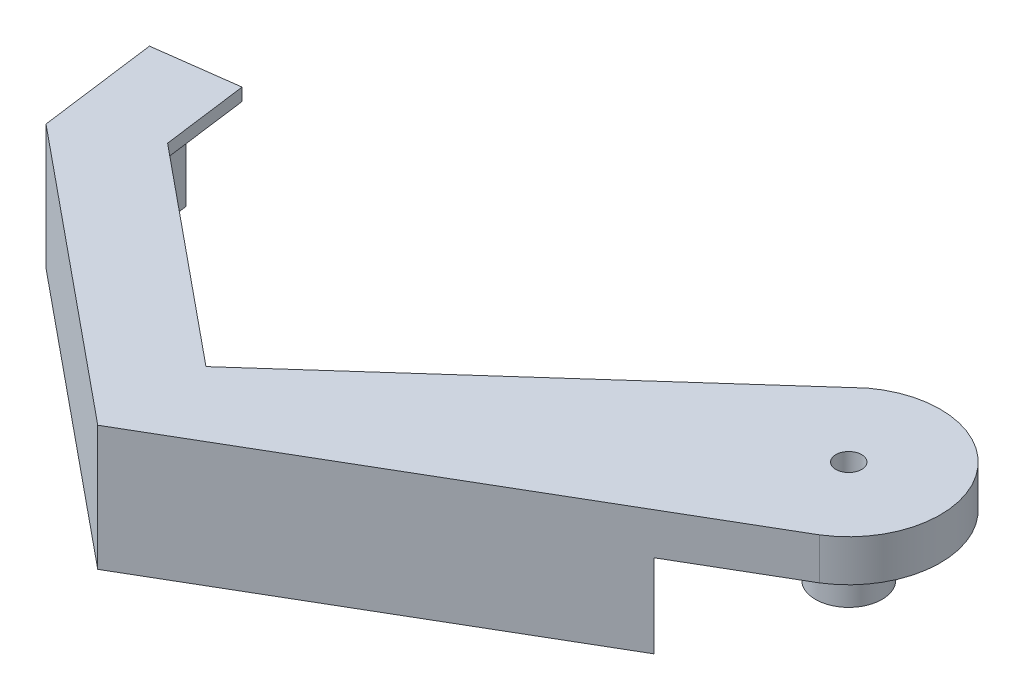
ISO-10303-21;
HEADER;
FILE_DESCRIPTION(('STEP AP214'),'2;1');
FILE_NAME('part.step','',(''),(''),'','','');
FILE_SCHEMA(('AUTOMOTIVE_DESIGN { 1 0 10303 214 1 1 1 1 }'));
ENDSEC;
DATA;
#1=APPLICATION_CONTEXT('core data for automotive mechanical design processes');
#2=APPLICATION_PROTOCOL_DEFINITION('international standard','automotive_design',2000,#1);
#3=PRODUCT_CONTEXT('',#1,'mechanical');
#4=PRODUCT('Part','Part','',(#3));
#5=PRODUCT_RELATED_PRODUCT_CATEGORY('part','',(#4));
#6=PRODUCT_DEFINITION_FORMATION('','',#4);
#7=PRODUCT_DEFINITION_CONTEXT('part definition',#1,'design');
#8=PRODUCT_DEFINITION('design','',#6,#7);
#9=PRODUCT_DEFINITION_SHAPE('','',#8);
#10=(LENGTH_UNIT() NAMED_UNIT(*) SI_UNIT(.MILLI.,.METRE.));
#11=(NAMED_UNIT(*) PLANE_ANGLE_UNIT() SI_UNIT($,.RADIAN.));
#12=(NAMED_UNIT(*) SI_UNIT($,.STERADIAN.) SOLID_ANGLE_UNIT());
#13=UNCERTAINTY_MEASURE_WITH_UNIT(LENGTH_MEASURE(1.E-05),#10,'distance_accuracy_value','');
#14=(GEOMETRIC_REPRESENTATION_CONTEXT(3) GLOBAL_UNCERTAINTY_ASSIGNED_CONTEXT((#13)) GLOBAL_UNIT_ASSIGNED_CONTEXT((#10,
#11,#12)) REPRESENTATION_CONTEXT('',''));
#15=CARTESIAN_POINT('',(0.,0.,0.));
#16=DIRECTION('',(0.,0.,1.));
#17=DIRECTION('',(1.,0.,0.));
#18=AXIS2_PLACEMENT_3D('',#15,#16,#17);
#19=CARTESIAN_POINT('',(0.,3.70000000000001,0.));
#20=DIRECTION('',(0.,-1.,0.));
#21=DIRECTION('',(0.,0.,-1.));
#22=AXIS2_PLACEMENT_3D('',#19,#20,#21);
#23=CYLINDRICAL_SURFACE('',#22,1.55);
#24=CARTESIAN_POINT('',(0.,3.,0.));
#25=DIRECTION('',(0.,1.,0.));
#26=DIRECTION('',(0.,0.,1.));
#27=AXIS2_PLACEMENT_3D('',#24,#25,#26);
#28=CIRCLE('',#27,1.55);
#29=CARTESIAN_POINT('',(0.,3.,1.55));
#30=VERTEX_POINT('',#29);
#31=EDGE_CURVE('E374',#30,#30,#28,.T.);
#32=ORIENTED_EDGE('',*,*,#31,.T.);
#33=EDGE_LOOP('',(#32));
#34=FACE_BOUND('',#33,.T.);
#35=CARTESIAN_POINT('',(0.,-2.8,0.));
#36=DIRECTION('',(0.,-1.,0.));
#37=DIRECTION('',(0.,0.,-1.));
#38=AXIS2_PLACEMENT_3D('',#35,#36,#37);
#39=CIRCLE('',#38,1.55);
#40=CARTESIAN_POINT('',(0.,-2.8,-1.55));
#41=VERTEX_POINT('',#40);
#42=EDGE_CURVE('E42',#41,#41,#39,.F.);
#43=ORIENTED_EDGE('',*,*,#42,.F.);
#44=EDGE_LOOP('',(#43));
#45=FACE_BOUND('',#44,.T.);
#46=ADVANCED_FACE('F38',(#34,#45),#23,.F.);
#47=CARTESIAN_POINT('',(-48.9483075080207,-2.,41.2817048164153));
#48=DIRECTION('',(-0.50386727867447,0.,-0.863781086549818));
#49=DIRECTION('',(-0.863781086549818,0.,0.50386727867447));
#50=AXIS2_PLACEMENT_3D('',#47,#48,#49);
#51=PLANE('',#50);
#52=DIRECTION('',(0.,1.,0.));
#53=VECTOR('',#52,1.);
#54=CARTESIAN_POINT('',(5.82912243152657,-2.,9.32852248098656));
#55=LINE('',#54,#53);
#56=CARTESIAN_POINT('',(5.82912243152657,-2.,9.32852248098656));
#57=VERTEX_POINT('',#56);
#58=CARTESIAN_POINT('',(5.82912243152657,3.,9.32852248098656));
#59=VERTEX_POINT('',#58);
#60=EDGE_CURVE('E48',#57,#59,#55,.T.);
#61=ORIENTED_EDGE('',*,*,#60,.T.);
#62=DIRECTION('',(-0.863781086549818,0.,0.50386727867447));
#63=VECTOR('',#62,1.);
#64=CARTESIAN_POINT('',(-48.9483075080207,3.,41.2817048164153));
#65=LINE('',#64,#63);
#66=CARTESIAN_POINT('',(-48.9483075080207,3.,41.2817048164153));
#67=VERTEX_POINT('',#66);
#68=EDGE_CURVE('E57',#59,#67,#65,.T.);
#69=ORIENTED_EDGE('',*,*,#68,.T.);
#70=DIRECTION('',(0.,1.,0.));
#71=VECTOR('',#70,1.);
#72=CARTESIAN_POINT('',(-48.9483075080207,-2.,41.2817048164153));
#73=LINE('',#72,#71);
#74=CARTESIAN_POINT('',(-48.9483075080207,-12.,41.2817048164153));
#75=VERTEX_POINT('',#74);
#76=EDGE_CURVE('E248',#75,#67,#73,.T.);
#77=ORIENTED_EDGE('',*,*,#76,.F.);
#78=DIRECTION('',(-0.863781086549818,0.,0.50386727867447));
#79=VECTOR('',#78,1.);
#80=CARTESIAN_POINT('',(-6.7200200176751,-12.,16.6487826186955));
#81=LINE('',#80,#79);
#82=CARTESIAN_POINT('',(-6.7200200176751,-12.,16.6487826186955));
#83=VERTEX_POINT('',#82);
#84=EDGE_CURVE('E185',#83,#75,#81,.T.);
#85=ORIENTED_EDGE('',*,*,#84,.F.);
#86=DIRECTION('',(0.,1.,0.));
#87=VECTOR('',#86,1.);
#88=CARTESIAN_POINT('',(-6.7200200176751,-12.,16.6487826186955));
#89=LINE('',#88,#87);
#90=CARTESIAN_POINT('',(-6.72002001767509,-2.,16.6487826186955));
#91=VERTEX_POINT('',#90);
#92=EDGE_CURVE('E273',#83,#91,#89,.T.);
#93=ORIENTED_EDGE('',*,*,#92,.T.);
#94=DIRECTION('',(-0.863781086549818,0.,0.50386727867447));
#95=VECTOR('',#94,1.);
#96=CARTESIAN_POINT('',(-48.9483075080207,-2.,41.2817048164153));
#97=LINE('',#96,#95);
#98=EDGE_CURVE('E242',#57,#91,#97,.T.);
#99=ORIENTED_EDGE('',*,*,#98,.F.);
#100=EDGE_LOOP('',(#61,#69,#77,#85,#93,#99));
#101=FACE_BOUND('',#100,.T.);
#102=ADVANCED_FACE('F319',(#101),#51,.F.);
#103=CARTESIAN_POINT('',(0.,-2.,0.));
#104=DIRECTION('',(0.,1.,0.));
#105=DIRECTION('',(0.,0.,1.));
#106=AXIS2_PLACEMENT_3D('',#103,#104,#105);
#107=PLANE('',#106);
#108=CARTESIAN_POINT('',(-2.27609272575313E-12,-2.,-4.13835632429027E-11));
#109=DIRECTION('',(0.,1.,0.));
#110=DIRECTION('',(0.,0.,1.));
#111=AXIS2_PLACEMENT_3D('',#108,#109,#110);
#112=CIRCLE('',#111,6.3);
#113=CARTESIAN_POINT('',(-2.27609272575313E-12,-2.,6.29999999995862));
#114=VERTEX_POINT('',#113);
#115=EDGE_CURVE('E243',#114,#114,#112,.F.);
#116=ORIENTED_EDGE('',*,*,#115,.F.);
#117=EDGE_LOOP('',(#116));
#118=FACE_BOUND('',#117,.T.);
#119=CARTESIAN_POINT('',(0.,-2.,0.));
#120=DIRECTION('',(0.,-1.,0.));
#121=DIRECTION('',(0.,0.,1.));
#122=AXIS2_PLACEMENT_3D('',#119,#120,#121);
#123=CIRCLE('',#122,10.9999999999999);
#124=CARTESIAN_POINT('',(-6.54255549837644,-2.,-8.84279184141876));
#125=VERTEX_POINT('',#124);
#126=EDGE_CURVE('E262',#125,#57,#123,.T.);
#127=ORIENTED_EDGE('',*,*,#126,.T.);
#128=ORIENTED_EDGE('',*,*,#98,.T.);
#129=CARTESIAN_POINT('',(0.,-2.,0.));
#130=DIRECTION('',(0.,1.,0.));
#131=DIRECTION('',(0.,0.,-1.));
#132=AXIS2_PLACEMENT_3D('',#129,#130,#131);
#133=CIRCLE('',#132,17.9538472679961);
#134=CARTESIAN_POINT('',(-12.8140115491981,-2.,12.5754419301887));
#135=VERTEX_POINT('',#134);
#136=EDGE_CURVE('E196',#135,#91,#133,.T.);
#137=ORIENTED_EDGE('',*,*,#136,.F.);
#138=CARTESIAN_POINT('',(0.,-2.,0.));
#139=DIRECTION('',(0.,1.,0.));
#140=DIRECTION('',(0.,0.,-1.));
#141=AXIS2_PLACEMENT_3D('',#138,#139,#140);
#142=CIRCLE('',#141,17.9538472679961);
#143=CARTESIAN_POINT('',(-17.9060104259916,-2.,1.30974132820591));
#144=VERTEX_POINT('',#143);
#145=EDGE_CURVE('E204',#144,#135,#142,.T.);
#146=ORIENTED_EDGE('',*,*,#145,.F.);
#147=DIRECTION('',(0.745722729369561,0.,-0.666256415279893));
#148=VECTOR('',#147,1.);
#149=CARTESIAN_POINT('',(-6.54255549837644,-2.,-8.84279184141876));
#150=LINE('',#149,#148);
#151=EDGE_CURVE('E277',#144,#125,#150,.T.);
#152=ORIENTED_EDGE('',*,*,#151,.T.);
#153=EDGE_LOOP('',(#127,#128,#137,#146,#152));
#154=FACE_BOUND('',#153,.T.);
#155=ADVANCED_FACE('F399',(#118,#154),#107,.F.);
#156=CARTESIAN_POINT('',(0.,3.,0.));
#157=DIRECTION('',(0.,1.,0.));
#158=DIRECTION('',(0.,0.,1.));
#159=AXIS2_PLACEMENT_3D('',#156,#157,#158);
#160=PLANE('',#159);
#161=ORIENTED_EDGE('',*,*,#31,.F.);
#162=EDGE_LOOP('',(#161));
#163=FACE_BOUND('',#162,.T.);
#164=ORIENTED_EDGE('',*,*,#68,.F.);
#165=CARTESIAN_POINT('',(0.,3.,0.));
#166=DIRECTION('',(0.,-1.,0.));
#167=DIRECTION('',(0.,0.,1.));
#168=AXIS2_PLACEMENT_3D('',#165,#166,#167);
#169=CIRCLE('',#168,10.9999999999999);
#170=CARTESIAN_POINT('',(-6.54255549837644,3.,-8.84279184141876));
#171=VERTEX_POINT('',#170);
#172=EDGE_CURVE('E258',#171,#59,#169,.T.);
#173=ORIENTED_EDGE('',*,*,#172,.F.);
#174=DIRECTION('',(0.745722729369561,0.,-0.666256415279893));
#175=VECTOR('',#174,1.);
#176=CARTESIAN_POINT('',(-6.54255549837644,3.,-8.84279184141876));
#177=LINE('',#176,#175);
#178=CARTESIAN_POINT('',(-48.5446549407446,3.,28.6834456012294));
#179=VERTEX_POINT('',#178);
#180=EDGE_CURVE('E202',#179,#171,#177,.T.);
#181=ORIENTED_EDGE('',*,*,#180,.F.);
#182=DIRECTION('',(0.77345150978173,0.,0.633855474076199));
#183=VECTOR('',#182,1.);
#184=CARTESIAN_POINT('',(-74.0969141553462,3.,7.74297399653901));
#185=LINE('',#184,#183);
#186=CARTESIAN_POINT('',(-74.0969141553462,3.,7.74297399653901));
#187=VERTEX_POINT('',#186);
#188=EDGE_CURVE('E255',#187,#179,#185,.T.);
#189=ORIENTED_EDGE('',*,*,#188,.F.);
#190=DIRECTION('',(0.130896701268676,0.,0.991396012498022));
#191=VECTOR('',#190,1.);
#192=CARTESIAN_POINT('',(-75.4582398485404,3.,-2.56754453344042));
#193=LINE('',#192,#191);
#194=CARTESIAN_POINT('',(-75.4582398485404,3.,-2.56754453344042));
#195=VERTEX_POINT('',#194);
#196=EDGE_CURVE('E252',#195,#187,#193,.T.);
#197=ORIENTED_EDGE('',*,*,#196,.F.);
#198=DIRECTION('',(0.991396012498023,0.,-0.130896701268675));
#199=VECTOR('',#198,1.);
#200=CARTESIAN_POINT('',(-75.4582398485404,3.,-2.56754453344042));
#201=LINE('',#200,#199);
#202=CARTESIAN_POINT('',(-85.2869003845102,3.,-1.26983985657133));
#203=VERTEX_POINT('',#202);
#204=EDGE_CURVE('E247',#203,#195,#201,.T.);
#205=ORIENTED_EDGE('',*,*,#204,.F.);
#206=DIRECTION('',(-0.130896701268675,0.,-0.991396012498023));
#207=VECTOR('',#206,1.);
#208=CARTESIAN_POINT('',(-85.2869003845102,3.,-1.26983985657133));
#209=LINE('',#208,#207);
#210=CARTESIAN_POINT('',(-83.396048293419,3.,13.0512484914357));
#211=VERTEX_POINT('',#210);
#212=EDGE_CURVE('E179',#211,#203,#209,.T.);
#213=ORIENTED_EDGE('',*,*,#212,.F.);
#214=DIRECTION('',(-0.77345150978173,0.,-0.633855474076199));
#215=VECTOR('',#214,1.);
#216=CARTESIAN_POINT('',(-48.9483075080207,3.,41.2817048164153));
#217=LINE('',#216,#215);
#218=EDGE_CURVE('E174',#67,#211,#217,.T.);
#219=ORIENTED_EDGE('',*,*,#218,.F.);
#220=EDGE_LOOP('',(#164,#173,#181,#189,#197,#205,#213,#219));
#221=FACE_BOUND('',#220,.T.);
#222=ADVANCED_FACE('F320',(#163,#221),#160,.T.);
#223=CARTESIAN_POINT('',(0.,-2.,0.));
#224=DIRECTION('',(0.,1.,0.));
#225=DIRECTION('',(0.,0.,1.));
#226=AXIS2_PLACEMENT_3D('',#223,#224,#225);
#227=CYLINDRICAL_SURFACE('',#226,10.9999999999999);
#228=ORIENTED_EDGE('',*,*,#60,.F.);
#229=ORIENTED_EDGE('',*,*,#126,.F.);
#230=DIRECTION('',(0.,1.,0.));
#231=VECTOR('',#230,1.);
#232=CARTESIAN_POINT('',(-6.54255549837644,-2.,-8.84279184141876));
#233=LINE('',#232,#231);
#234=EDGE_CURVE('E259',#125,#171,#233,.T.);
#235=ORIENTED_EDGE('',*,*,#234,.T.);
#236=ORIENTED_EDGE('',*,*,#172,.T.);
#237=EDGE_LOOP('',(#228,#229,#235,#236));
#238=FACE_BOUND('',#237,.T.);
#239=ADVANCED_FACE('F408',(#238),#227,.T.);
#240=CARTESIAN_POINT('',(-6.54255549837644,-2.,-8.84279184141876));
#241=DIRECTION('',(0.666256415279893,0.,0.745722729369561));
#242=DIRECTION('',(0.745722729369561,0.,-0.666256415279893));
#243=AXIS2_PLACEMENT_3D('',#240,#241,#242);
#244=PLANE('',#243);
#245=DIRECTION('',(0.,-1.,0.));
#246=VECTOR('',#245,1.);
#247=CARTESIAN_POINT('',(-17.9060104259916,0.5,1.30974132820591));
#248=LINE('',#247,#246);
#249=CARTESIAN_POINT('',(-17.9060104259916,-1.98996327137203,1.30974132820591));
#250=VERTEX_POINT('',#249);
#251=EDGE_CURVE('E127',#250,#144,#248,.T.);
#252=ORIENTED_EDGE('',*,*,#251,.F.);
#253=CARTESIAN_POINT('',(-20.5527162274617,1.67779084483573,3.67440670601832));
#254=CARTESIAN_POINT('',(-20.563587183136,1.62344224762437,3.68411922204195));
#255=CARTESIAN_POINT('',(-20.5731463744474,1.56863301235754,3.69265975900737));
#256=CARTESIAN_POINT('',(-20.5895865959824,1.45830482470025,3.70734806423791));
#257=CARTESIAN_POINT('',(-20.5964679798515,1.40278596702725,3.71349614846308));
#258=CARTESIAN_POINT('',(-20.6130185994757,1.23544723681756,3.72828308745151));
#259=CARTESIAN_POINT('',(-20.6185917019359,1.12285818215963,3.73326230441896));
#260=CARTESIAN_POINT('',(-20.6185986978099,0.86045280736267,3.73326855479294));
#261=CARTESIAN_POINT('',(-20.608750085026,0.710611577728313,3.72446943792223));
#262=CARTESIAN_POINT('',(-20.5698398893561,0.415509893643703,3.68970562227886));
#263=CARTESIAN_POINT('',(-20.5407735503216,0.270250582487615,3.66373667418637));
#264=CARTESIAN_POINT('',(-20.4649802903073,-0.0112133567973825,3.5960201574024));
#265=CARTESIAN_POINT('',(-20.4183033047027,-0.147442318405545,3.55431720283206));
#266=CARTESIAN_POINT('',(-20.3093428780715,-0.408133035892731,3.45696790610881));
#267=CARTESIAN_POINT('',(-20.2470546258765,-0.532591147848141,3.40131726547916));
#268=CARTESIAN_POINT('',(-20.1058500330872,-0.77329544276604,3.27515983174716));
#269=CARTESIAN_POINT('',(-20.0262641947568,-0.888832085155726,3.20405488447291));
#270=CARTESIAN_POINT('',(-19.8553415817637,-1.10294506957164,3.05134626645969));
#271=CARTESIAN_POINT('',(-19.7640015362972,-1.20151667288022,2.9697396734631));
#272=CARTESIAN_POINT('',(-19.5589963347251,-1.39336599562526,2.78658040349064));
#273=CARTESIAN_POINT('',(-19.4439879584825,-1.48405702357262,2.68382764369834));
#274=CARTESIAN_POINT('',(-19.2055454545972,-1.64257745618892,2.47079424451082));
#275=CARTESIAN_POINT('',(-19.0821061227836,-1.71039258407108,2.36050895551585));
#276=CARTESIAN_POINT('',(-18.8080587866526,-1.83337884726971,2.11566487527442));
#277=CARTESIAN_POINT('',(-18.6564163300103,-1.88440035354444,1.98018186585596));
#278=CARTESIAN_POINT('',(-18.3493175408582,-1.95714971889493,1.70580838850432));
#279=CARTESIAN_POINT('',(-18.1938594504494,-1.9788638076752,1.56691634999878));
#280=CARTESIAN_POINT('',(-17.8549016867533,-1.99583714388621,1.26407888014942));
#281=CARTESIAN_POINT('',(-17.6712543665228,-1.98580344582471,1.10000153553639));
#282=CARTESIAN_POINT('',(-17.3068546051834,-1.92932828543307,0.774433238960395));
#283=CARTESIAN_POINT('',(-17.1261063292344,-1.88283852481262,0.612946008306221));
#284=CARTESIAN_POINT('',(-16.849461536696,-1.78285934477431,0.365781263926819));
#285=CARTESIAN_POINT('',(-16.7510730733484,-1.74135303227732,0.277877352307758));
#286=CARTESIAN_POINT('',(-16.5572150233803,-1.64731662594789,0.10467736207267));
#287=CARTESIAN_POINT('',(-16.4617461556412,-1.59478384175087,0.0193819257320101));
#288=CARTESIAN_POINT('',(-16.2746973240672,-1.47874286026964,-0.147734455596674));
#289=CARTESIAN_POINT('',(-16.1831135427376,-1.41524576303724,-0.229558811276384));
#290=CARTESIAN_POINT('',(-16.0047844094393,-1.27714027077309,-0.388884689933398));
#291=CARTESIAN_POINT('',(-15.9180365162036,-1.202537788755,-0.466388483373024));
#292=CARTESIAN_POINT('',(-15.7253123786166,-1.01774172810449,-0.638575394123656));
#293=CARTESIAN_POINT('',(-15.621408642715,-0.903594513808976,-0.731406855321662));
#294=CARTESIAN_POINT('',(-15.4276741531794,-0.655510736765156,-0.904496452071928));
#295=CARTESIAN_POINT('',(-15.3378225855433,-0.52160402463079,-0.984773183627494));
#296=CARTESIAN_POINT('',(-15.1960436260843,-0.267340299498781,-1.11144377789935));
#297=CARTESIAN_POINT('',(-15.140148822152,-0.150978348162458,-1.16138227411788));
#298=CARTESIAN_POINT('',(-15.043163232921,0.0922365525724665,-1.24803280583697));
#299=CARTESIAN_POINT('',(-15.0020284969819,0.219056949517931,-1.28478410847389));
#300=CARTESIAN_POINT('',(-14.9568706528579,0.40274325515857,-1.3251298055579));
#301=CARTESIAN_POINT('',(-14.9453195774546,0.456398008308661,-1.33544996583695));
#302=CARTESIAN_POINT('',(-14.9253472673011,0.564748512141565,-1.35329397037602));
#303=CARTESIAN_POINT('',(-14.9169253046656,0.619444017611745,-1.36081846495577));
#304=CARTESIAN_POINT('',(-14.9033234420317,0.729942393887272,-1.37297087480282));
#305=CARTESIAN_POINT('',(-14.8981662349829,0.785750293214965,-1.37757851534522));
#306=CARTESIAN_POINT('',(-14.8912680731225,0.897781570627464,-1.3837415896517));
#307=CARTESIAN_POINT('',(-14.8895294440171,0.954005205459027,-1.38529494554343));
#308=CARTESIAN_POINT('',(-14.8895447958906,1.01023672862796,-1.38528122960879));
#309=B_SPLINE_CURVE_WITH_KNOTS('',3,(#253,#254,#255,#256,#257,#258,#259,#260,#261,#262,#263,
#264,#265,#266,#267,#268,#269,#270,#271,#272,#273,#274,#275,#276,#277,#278,#279,#280,#281,#282,
#283,#284,#285,#286,#287,#288,#289,#290,#291,#292,#293,#294,#295,#296,#297,#298,#299,#300,#301,
#302,#303,#304,#305,#306,#307,#308),.UNSPECIFIED.,.F.,.F.,(4,2,2,2,2,2,2,2,2,2,2,2,2,2,2,2,2,2,
2,2,2,2,2,2,2,2,2,4),(0.,0.168757231695496,0.337492168842086,0.675002031321835,1.123882320846,
1.5728737442678,2.0206014959112,2.46846740086083,2.93846112832635,3.40858592331717,
3.94328266424101,4.47831249320547,5.10489995082982,5.73178171259272,6.46833748737586,
7.20587072948837,7.62038798366339,8.03500649430799,8.44920768840627,8.86318912653368,
9.40178896776002,9.93958332353899,10.3533740066754,10.7659221269471,10.9333281606748,
11.1006952284744,11.2692132289477,11.4378458349482),.UNSPECIFIED.);
#310=CARTESIAN_POINT('',(-20.5833459574663,1.5,3.70177244573649));
#311=VERTEX_POINT('',#310);
#312=EDGE_CURVE('E233',#311,#250,#309,.T.);
#313=ORIENTED_EDGE('',*,*,#312,.F.);
#314=DIRECTION('',(0.745722729369561,0.,-0.666256415279893));
#315=VECTOR('',#314,1.);
#316=CARTESIAN_POINT('',(-6.54255549837644,1.5,-8.84279184141876));
#317=LINE('',#316,#315);
#318=CARTESIAN_POINT('',(-48.5446549407446,1.5,28.6834456012294));
#319=VERTEX_POINT('',#318);
#320=EDGE_CURVE('E94',#319,#311,#317,.T.);
#321=ORIENTED_EDGE('',*,*,#320,.F.);
#322=DIRECTION('',(0.,1.,0.));
#323=VECTOR('',#322,1.);
#324=CARTESIAN_POINT('',(-48.5446549407446,-2.,28.6834456012294));
#325=LINE('',#324,#323);
#326=EDGE_CURVE('E256',#319,#179,#325,.T.);
#327=ORIENTED_EDGE('',*,*,#326,.T.);
#328=ORIENTED_EDGE('',*,*,#180,.T.);
#329=ORIENTED_EDGE('',*,*,#234,.F.);
#330=ORIENTED_EDGE('',*,*,#151,.F.);
#331=EDGE_LOOP('',(#252,#313,#321,#327,#328,#329,#330));
#332=FACE_BOUND('',#331,.T.);
#333=ADVANCED_FACE('F412',(#332),#244,.F.);
#334=CARTESIAN_POINT('',(-12.8140115491981,-12.,12.5754419301887));
#335=DIRECTION('',(0.552518666338758,0.,0.833500523903398));
#336=DIRECTION('',(0.833500523903398,0.,-0.552518666338758));
#337=AXIS2_PLACEMENT_3D('',#334,#335,#336);
#338=PLANE('',#337);
#339=CARTESIAN_POINT('',(-12.8138115491981,-1.98996326212037,12.5753093523077));
#340=CARTESIAN_POINT('',(-12.8861494463844,-1.98997734845643,12.6232613779308));
#341=CARTESIAN_POINT('',(-12.9584855326908,-1.98634572972415,12.6712122031408));
#342=CARTESIAN_POINT('',(-13.1026517724153,-1.97183632437083,12.7667784760097));
#343=CARTESIAN_POINT('',(-13.1744819204139,-1.96095846024671,12.8143939200759));
#344=CARTESIAN_POINT('',(-13.3171284153218,-1.9320026175452,12.9089527702075));
#345=CARTESIAN_POINT('',(-13.3879448186929,-1.9139250415938,12.9558962137008));
#346=CARTESIAN_POINT('',(-13.5280388308723,-1.87069480914041,13.0487630500754));
#347=CARTESIAN_POINT('',(-13.5973164792012,-1.845542334573,13.0946864691543));
#348=CARTESIAN_POINT('',(-13.8022073957948,-1.75962182041379,13.2305064869403));
#349=CARTESIAN_POINT('',(-13.9348935231491,-1.68838766274151,13.3184627149511));
#350=CARTESIAN_POINT('',(-14.1881360167163,-1.52000145756594,13.4863344808268));
#351=CARTESIAN_POINT('',(-14.3086983369555,-1.42286221854829,13.5662539655529));
#352=CARTESIAN_POINT('',(-14.5330693563744,-1.20638263698619,13.7149871371097));
#353=CARTESIAN_POINT('',(-14.6370374980984,-1.0872807129801,13.7839065167137));
#354=CARTESIAN_POINT('',(-14.8265732845887,-0.829489910052627,13.9095477814422));
#355=CARTESIAN_POINT('',(-14.9121310360826,-0.690790565967032,13.9662631084212));
#356=CARTESIAN_POINT('',(-15.068834202042,-0.384699677121168,14.0701399768622));
#357=CARTESIAN_POINT('',(-15.1380149373705,-0.215852589273894,14.11599915334));
#358=CARTESIAN_POINT('',(-15.2486689014827,0.134398643479078,14.1893504937687));
#359=CARTESIAN_POINT('',(-15.2901516116301,0.315798467942584,14.2168489428152));
#360=CARTESIAN_POINT('',(-15.3409449807992,0.664362843169058,14.2505193290804));
#361=CARTESIAN_POINT('',(-15.3532869382433,0.830904656879614,14.2587006819068));
#362=CARTESIAN_POINT('',(-15.3544423403907,1.16418505884622,14.2594665857488));
#363=CARTESIAN_POINT('',(-15.3432601094116,1.33092360530679,14.2520540033087));
#364=CARTESIAN_POINT('',(-15.3091604789678,1.57734792162012,14.2294497195739));
#365=CARTESIAN_POINT('',(-15.2949015794689,1.65889157862398,14.2199976461695));
#366=CARTESIAN_POINT('',(-15.2607173300507,1.8202760432854,14.197337269413));
#367=CARTESIAN_POINT('',(-15.2407918893173,1.90011682363,14.1841289058613));
#368=CARTESIAN_POINT('',(-15.1954008890068,2.05757301654733,14.1540396926742));
#369=CARTESIAN_POINT('',(-15.169930311722,2.1351863410635,14.1371555168534));
#370=CARTESIAN_POINT('',(-15.1136584282808,2.28758161698616,14.0998534815221));
#371=CARTESIAN_POINT('',(-15.0828570115985,2.36236350964856,14.0794355487452));
#372=CARTESIAN_POINT('',(-15.0494901155466,2.43546289868268,14.0573169868753));
#373=B_SPLINE_CURVE_WITH_KNOTS('',3,(#339,#340,#341,#342,#343,#344,#345,#346,#347,#348,#349,
#350,#351,#352,#353,#354,#355,#356,#357,#358,#359,#360,#361,#362,#363,#364,#365,#366,#367,#368,
#369,#370,#371,#372),.UNSPECIFIED.,.F.,.F.,(4,2,2,2,2,2,2,2,2,2,2,2,2,2,2,2,4),(0.,
0.260283055333545,0.520568894599923,0.780840180070607,1.04110477314609,1.56158029731357,
2.08179895362228,2.59667136002018,3.11181975850408,3.67289068517409,4.23376945198808,
4.73308988607574,5.23231854095062,5.48203399938141,5.73175346006719,5.98169983423989,
6.23165139124525),.UNSPECIFIED.);
#374=CARTESIAN_POINT('',(-12.8140115491981,-1.98996327137203,12.5754419301887));
#375=VERTEX_POINT('',#374);
#376=CARTESIAN_POINT('',(-15.3198600491335,1.5,14.2365423512746));
#377=VERTEX_POINT('',#376);
#378=EDGE_CURVE('E207',#375,#377,#373,.T.);
#379=ORIENTED_EDGE('',*,*,#378,.F.);
#380=DIRECTION('',(0.,-1.,0.));
#381=VECTOR('',#380,1.);
#382=CARTESIAN_POINT('',(-12.8140115491981,0.5,12.5754419301887));
#383=LINE('',#382,#381);
#384=EDGE_CURVE('E137',#375,#135,#383,.T.);
#385=ORIENTED_EDGE('',*,*,#384,.T.);
#386=DIRECTION('',(0.,1.,0.));
#387=VECTOR('',#386,1.);
#388=CARTESIAN_POINT('',(-12.8140115491981,-12.,12.5754419301887));
#389=LINE('',#388,#387);
#390=CARTESIAN_POINT('',(-12.8140115491981,-12.,12.5754419301887));
#391=VERTEX_POINT('',#390);
#392=EDGE_CURVE('E191',#391,#135,#389,.T.);
#393=ORIENTED_EDGE('',*,*,#392,.F.);
#394=DIRECTION('',(0.833500523903398,0.,-0.552518666338758));
#395=VECTOR('',#394,1.);
#396=CARTESIAN_POINT('',(-12.8140115491981,-12.,12.5754419301887));
#397=LINE('',#396,#395);
#398=CARTESIAN_POINT('',(-48.9483075080207,-12.,36.5284838776134));
#399=VERTEX_POINT('',#398);
#400=EDGE_CURVE('E294',#399,#391,#397,.T.);
#401=ORIENTED_EDGE('',*,*,#400,.F.);
#402=DIRECTION('',(0.,1.,0.));
#403=VECTOR('',#402,1.);
#404=CARTESIAN_POINT('',(-48.9483075080207,-12.,36.5284838776134));
#405=LINE('',#404,#403);
#406=CARTESIAN_POINT('',(-48.9483075080207,1.5,36.5284838776134));
#407=VERTEX_POINT('',#406);
#408=EDGE_CURVE('E201',#399,#407,#405,.T.);
#409=ORIENTED_EDGE('',*,*,#408,.T.);
#410=DIRECTION('',(-0.833500523903398,0.,0.552518666338758));
#411=VECTOR('',#410,1.);
#412=CARTESIAN_POINT('',(-48.9483075080207,1.5,36.5284838776134));
#413=LINE('',#412,#411);
#414=EDGE_CURVE('E332',#377,#407,#413,.T.);
#415=ORIENTED_EDGE('',*,*,#414,.F.);
#416=EDGE_LOOP('',(#379,#385,#393,#401,#409,#415));
#417=FACE_BOUND('',#416,.T.);
#418=ADVANCED_FACE('F218',(#417),#338,.F.);
#419=CARTESIAN_POINT('',(0.,0.5,0.));
#420=DIRECTION('',(0.,-1.,0.));
#421=DIRECTION('',(0.,0.,-1.));
#422=AXIS2_PLACEMENT_3D('',#419,#420,#421);
#423=CYLINDRICAL_SURFACE('',#422,17.9538472679961);
#424=CARTESIAN_POINT('',(0.,-1.98996327137203,0.));
#425=DIRECTION('',(0.,1.,0.));
#426=DIRECTION('',(0.,0.,1.));
#427=AXIS2_PLACEMENT_3D('',#424,#425,#426);
#428=CIRCLE('',#427,17.9538472679961);
#429=EDGE_CURVE('E216',#250,#375,#428,.T.);
#430=ORIENTED_EDGE('',*,*,#429,.F.);
#431=ORIENTED_EDGE('',*,*,#251,.T.);
#432=ORIENTED_EDGE('',*,*,#145,.T.);
#433=ORIENTED_EDGE('',*,*,#384,.F.);
#434=EDGE_LOOP('',(#430,#431,#432,#433));
#435=FACE_BOUND('',#434,.T.);
#436=ADVANCED_FACE('F228',(#435),#423,.T.);
#437=CARTESIAN_POINT('',(-75.4582398485404,-2.,-2.56754453344042));
#438=DIRECTION('',(-0.991396012498022,0.,0.130896701268676));
#439=DIRECTION('',(0.130896701268676,0.,0.991396012498022));
#440=AXIS2_PLACEMENT_3D('',#437,#438,#439);
#441=PLANE('',#440);
#442=DIRECTION('',(0.130896701268676,0.,0.991396012498022));
#443=VECTOR('',#442,1.);
#444=CARTESIAN_POINT('',(-75.4582398485404,1.5,-2.56754453344042));
#445=LINE('',#444,#443);
#446=CARTESIAN_POINT('',(-75.4582398485404,1.5,-2.56754453344042));
#447=VERTEX_POINT('',#446);
#448=CARTESIAN_POINT('',(-74.0969141553462,1.5,7.74297399653901));
#449=VERTEX_POINT('',#448);
#450=EDGE_CURVE('E330',#447,#449,#445,.T.);
#451=ORIENTED_EDGE('',*,*,#450,.F.);
#452=DIRECTION('',(0.,1.,0.));
#453=VECTOR('',#452,1.);
#454=CARTESIAN_POINT('',(-75.4582398485404,-2.,-2.56754453344042));
#455=LINE('',#454,#453);
#456=EDGE_CURVE('E206',#447,#195,#455,.T.);
#457=ORIENTED_EDGE('',*,*,#456,.T.);
#458=ORIENTED_EDGE('',*,*,#196,.T.);
#459=DIRECTION('',(0.,1.,0.));
#460=VECTOR('',#459,1.);
#461=CARTESIAN_POINT('',(-74.0969141553462,-2.,7.74297399653901));
#462=LINE('',#461,#460);
#463=EDGE_CURVE('E253',#449,#187,#462,.T.);
#464=ORIENTED_EDGE('',*,*,#463,.F.);
#465=EDGE_LOOP('',(#451,#457,#458,#464));
#466=FACE_BOUND('',#465,.T.);
#467=ADVANCED_FACE('F419',(#466),#441,.F.);
#468=CARTESIAN_POINT('',(-74.0969141553462,-2.,7.74297399653901));
#469=DIRECTION('',(-0.633855474076199,0.,0.77345150978173));
#470=DIRECTION('',(0.77345150978173,0.,0.633855474076199));
#471=AXIS2_PLACEMENT_3D('',#468,#469,#470);
#472=PLANE('',#471);
#473=DIRECTION('',(0.77345150978173,0.,0.633855474076199));
#474=VECTOR('',#473,1.);
#475=CARTESIAN_POINT('',(-74.0969141553462,1.5,7.74297399653901));
#476=LINE('',#475,#474);
#477=EDGE_CURVE('E241',#449,#319,#476,.T.);
#478=ORIENTED_EDGE('',*,*,#477,.F.);
#479=ORIENTED_EDGE('',*,*,#463,.T.);
#480=ORIENTED_EDGE('',*,*,#188,.T.);
#481=ORIENTED_EDGE('',*,*,#326,.F.);
#482=EDGE_LOOP('',(#478,#479,#480,#481));
#483=FACE_BOUND('',#482,.T.);
#484=ADVANCED_FACE('F416',(#483),#472,.F.);
#485=CARTESIAN_POINT('',(-48.9483075080207,-2.,41.2817048164153));
#486=DIRECTION('',(0.633855474076199,0.,-0.77345150978173));
#487=DIRECTION('',(-0.77345150978173,0.,-0.633855474076199));
#488=AXIS2_PLACEMENT_3D('',#485,#486,#487);
#489=PLANE('',#488);
#490=ORIENTED_EDGE('',*,*,#218,.T.);
#491=DIRECTION('',(0.,1.,0.));
#492=VECTOR('',#491,1.);
#493=CARTESIAN_POINT('',(-83.396048293419,-2.,13.0512484914357));
#494=LINE('',#493,#492);
#495=CARTESIAN_POINT('',(-83.396048293419,-12.,13.0512484914357));
#496=VERTEX_POINT('',#495);
#497=EDGE_CURVE('E169',#496,#211,#494,.T.);
#498=ORIENTED_EDGE('',*,*,#497,.F.);
#499=DIRECTION('',(-0.77345150978173,0.,-0.633855474076199));
#500=VECTOR('',#499,1.);
#501=CARTESIAN_POINT('',(-48.9483075080207,-12.,41.2817048164153));
#502=LINE('',#501,#500);
#503=EDGE_CURVE('E173',#75,#496,#502,.T.);
#504=ORIENTED_EDGE('',*,*,#503,.F.);
#505=ORIENTED_EDGE('',*,*,#76,.T.);
#506=EDGE_LOOP('',(#490,#498,#504,#505));
#507=FACE_BOUND('',#506,.T.);
#508=ADVANCED_FACE('F171',(#507),#489,.F.);
#509=CARTESIAN_POINT('',(-85.2869003845102,-2.,-1.26983985657133));
#510=DIRECTION('',(0.991396012498023,0.,-0.130896701268675));
#511=DIRECTION('',(-0.130896701268675,0.,-0.991396012498023));
#512=AXIS2_PLACEMENT_3D('',#509,#510,#511);
#513=PLANE('',#512);
#514=ORIENTED_EDGE('',*,*,#212,.T.);
#515=DIRECTION('',(0.,1.,0.));
#516=VECTOR('',#515,1.);
#517=CARTESIAN_POINT('',(-85.2869003845102,-2.,-1.26983985657133));
#518=LINE('',#517,#516);
#519=CARTESIAN_POINT('',(-85.2869003845102,-12.,-1.26983985657133));
#520=VERTEX_POINT('',#519);
#521=EDGE_CURVE('E178',#520,#203,#518,.T.);
#522=ORIENTED_EDGE('',*,*,#521,.F.);
#523=DIRECTION('',(-0.130896701268675,0.,-0.991396012498023));
#524=VECTOR('',#523,1.);
#525=CARTESIAN_POINT('',(-83.396048293419,-12.,13.0512484914357));
#526=LINE('',#525,#524);
#527=EDGE_CURVE('E183',#496,#520,#526,.T.);
#528=ORIENTED_EDGE('',*,*,#527,.F.);
#529=ORIENTED_EDGE('',*,*,#497,.T.);
#530=EDGE_LOOP('',(#514,#522,#528,#529));
#531=FACE_BOUND('',#530,.T.);
#532=ADVANCED_FACE('F187',(#531),#513,.F.);
#533=CARTESIAN_POINT('',(-75.4582398485404,-2.,-2.56754453344042));
#534=DIRECTION('',(0.130896701268675,0.,0.991396012498023));
#535=DIRECTION('',(0.991396012498023,0.,-0.130896701268675));
#536=AXIS2_PLACEMENT_3D('',#533,#534,#535);
#537=PLANE('',#536);
#538=DIRECTION('',(0.991396012498023,0.,-0.130896701268675));
#539=VECTOR('',#538,1.);
#540=CARTESIAN_POINT('',(-75.4582398485404,1.5,-2.56754453344042));
#541=LINE('',#540,#539);
#542=CARTESIAN_POINT('',(-81.4016448587538,1.5,-1.78282066897744));
#543=VERTEX_POINT('',#542);
#544=EDGE_CURVE('E327',#543,#447,#541,.T.);
#545=ORIENTED_EDGE('',*,*,#544,.F.);
#546=DIRECTION('',(0.,1.,0.));
#547=VECTOR('',#546,1.);
#548=CARTESIAN_POINT('',(-81.4016448587538,-12.,-1.78282066897744));
#549=LINE('',#548,#547);
#550=CARTESIAN_POINT('',(-81.4016448587538,-12.,-1.78282066897744));
#551=VERTEX_POINT('',#550);
#552=EDGE_CURVE('E283',#551,#543,#549,.T.);
#553=ORIENTED_EDGE('',*,*,#552,.F.);
#554=DIRECTION('',(0.991396012498023,0.,-0.130896701268675));
#555=VECTOR('',#554,1.);
#556=CARTESIAN_POINT('',(-85.2869003845102,-12.,-1.26983985657133));
#557=LINE('',#556,#555);
#558=EDGE_CURVE('E190',#520,#551,#557,.T.);
#559=ORIENTED_EDGE('',*,*,#558,.F.);
#560=ORIENTED_EDGE('',*,*,#521,.T.);
#561=ORIENTED_EDGE('',*,*,#204,.T.);
#562=ORIENTED_EDGE('',*,*,#456,.F.);
#563=EDGE_LOOP('',(#545,#553,#559,#560,#561,#562));
#564=FACE_BOUND('',#563,.T.);
#565=ADVANCED_FACE('F325',(#564),#537,.F.);
#566=CARTESIAN_POINT('',(-2.27609272575313E-12,-2.3,-4.13835632429027E-11));
#567=DIRECTION('',(0.,1.,0.));
#568=DIRECTION('',(0.,0.,1.));
#569=AXIS2_PLACEMENT_3D('',#566,#567,#568);
#570=CYLINDRICAL_SURFACE('',#569,6.3);
#571=CARTESIAN_POINT('',(-2.27609272575313E-12,-2.3,-4.13835632429027E-11));
#572=DIRECTION('',(0.,-1.,0.));
#573=DIRECTION('',(0.,0.,-1.));
#574=AXIS2_PLACEMENT_3D('',#571,#572,#573);
#575=CIRCLE('',#574,6.3);
#576=CARTESIAN_POINT('',(-2.27609272575313E-12,-2.3,-6.30000000004138));
#577=VERTEX_POINT('',#576);
#578=EDGE_CURVE('E246',#577,#577,#575,.T.);
#579=ORIENTED_EDGE('',*,*,#578,.F.);
#580=EDGE_LOOP('',(#579));
#581=FACE_BOUND('',#580,.T.);
#582=ORIENTED_EDGE('',*,*,#115,.T.);
#583=EDGE_LOOP('',(#582));
#584=FACE_BOUND('',#583,.T.);
#585=ADVANCED_FACE('F390',(#581,#584),#570,.T.);
#586=CARTESIAN_POINT('',(-2.27609272575313E-12,-2.3,-4.13835632429027E-11));
#587=DIRECTION('',(0.,-1.,0.));
#588=DIRECTION('',(0.,0.,-1.));
#589=AXIS2_PLACEMENT_3D('',#586,#587,#588);
#590=PLANE('',#589);
#591=CARTESIAN_POINT('',(0.,-2.3,0.));
#592=DIRECTION('',(0.,-1.,0.));
#593=DIRECTION('',(0.,0.,-1.));
#594=AXIS2_PLACEMENT_3D('',#591,#592,#593);
#595=CIRCLE('',#594,3.99999999999929);
#596=CARTESIAN_POINT('',(0.,-2.3,-3.99999999999929));
#597=VERTEX_POINT('',#596);
#598=EDGE_CURVE('E12',#597,#597,#595,.T.);
#599=ORIENTED_EDGE('',*,*,#598,.F.);
#600=EDGE_LOOP('',(#599));
#601=FACE_BOUND('',#600,.T.);
#602=ORIENTED_EDGE('',*,*,#578,.T.);
#603=EDGE_LOOP('',(#602));
#604=FACE_BOUND('',#603,.T.);
#605=ADVANCED_FACE('F387',(#601,#604),#590,.T.);
#606=CARTESIAN_POINT('',(-81.4016448587538,-12.,-1.78282066897744));
#607=DIRECTION('',(-0.991396012498022,0.,0.130896701268675));
#608=DIRECTION('',(0.130896701268675,0.,0.991396012498023));
#609=AXIS2_PLACEMENT_3D('',#606,#607,#608);
#610=PLANE('',#609);
#611=ORIENTED_EDGE('',*,*,#552,.T.);
#612=DIRECTION('',(-0.130896701268675,0.,-0.991396012498022));
#613=VECTOR('',#612,1.);
#614=CARTESIAN_POINT('',(-81.4016448587538,1.5,-1.78282066897744));
#615=LINE('',#614,#613);
#616=CARTESIAN_POINT('',(-79.6671676575835,1.5,11.3539029026839));
#617=VERTEX_POINT('',#616);
#618=EDGE_CURVE('E306',#617,#543,#615,.T.);
#619=ORIENTED_EDGE('',*,*,#618,.F.);
#620=DIRECTION('',(0.,1.,0.));
#621=VECTOR('',#620,1.);
#622=CARTESIAN_POINT('',(-79.6671676575835,-12.,11.3539029026839));
#623=LINE('',#622,#621);
#624=CARTESIAN_POINT('',(-79.6671676575835,-12.,11.3539029026839));
#625=VERTEX_POINT('',#624);
#626=EDGE_CURVE('E285',#625,#617,#623,.T.);
#627=ORIENTED_EDGE('',*,*,#626,.F.);
#628=DIRECTION('',(0.130896701268675,0.,0.991396012498022));
#629=VECTOR('',#628,1.);
#630=CARTESIAN_POINT('',(-81.4016448587538,-12.,-1.78282066897744));
#631=LINE('',#630,#629);
#632=EDGE_CURVE('E193',#551,#625,#631,.T.);
#633=ORIENTED_EDGE('',*,*,#632,.F.);
#634=EDGE_LOOP('',(#611,#619,#627,#633));
#635=FACE_BOUND('',#634,.T.);
#636=ADVANCED_FACE('F304',(#635),#610,.F.);
#637=CARTESIAN_POINT('',(-79.6671676575835,-12.,11.3539029026839));
#638=DIRECTION('',(-0.633855474076199,0.,0.77345150978173));
#639=DIRECTION('',(0.77345150978173,0.,0.633855474076199));
#640=AXIS2_PLACEMENT_3D('',#637,#638,#639);
#641=PLANE('',#640);
#642=ORIENTED_EDGE('',*,*,#626,.T.);
#643=DIRECTION('',(-0.77345150978173,0.,-0.633855474076199));
#644=VECTOR('',#643,1.);
#645=CARTESIAN_POINT('',(-79.6671676575835,1.5,11.3539029026839));
#646=LINE('',#645,#644);
#647=EDGE_CURVE('E312',#407,#617,#646,.T.);
#648=ORIENTED_EDGE('',*,*,#647,.F.);
#649=ORIENTED_EDGE('',*,*,#408,.F.);
#650=DIRECTION('',(0.77345150978173,0.,0.633855474076199));
#651=VECTOR('',#650,1.);
#652=CARTESIAN_POINT('',(-79.6671676575835,-12.,11.3539029026839));
#653=LINE('',#652,#651);
#654=EDGE_CURVE('E296',#625,#399,#653,.T.);
#655=ORIENTED_EDGE('',*,*,#654,.F.);
#656=EDGE_LOOP('',(#642,#648,#649,#655));
#657=FACE_BOUND('',#656,.T.);
#658=ADVANCED_FACE('F310',(#657),#641,.F.);
#659=CARTESIAN_POINT('',(0.,-12.,0.));
#660=DIRECTION('',(0.,1.,0.));
#661=DIRECTION('',(0.,0.,1.));
#662=AXIS2_PLACEMENT_3D('',#659,#660,#661);
#663=CYLINDRICAL_SURFACE('',#662,17.9538472679961);
#664=ORIENTED_EDGE('',*,*,#136,.T.);
#665=ORIENTED_EDGE('',*,*,#92,.F.);
#666=CARTESIAN_POINT('',(0.,-12.,0.));
#667=DIRECTION('',(0.,1.,0.));
#668=DIRECTION('',(0.,0.,-1.));
#669=AXIS2_PLACEMENT_3D('',#666,#667,#668);
#670=CIRCLE('',#669,17.9538472679961);
#671=EDGE_CURVE('E103',#391,#83,#670,.T.);
#672=ORIENTED_EDGE('',*,*,#671,.F.);
#673=ORIENTED_EDGE('',*,*,#392,.T.);
#674=EDGE_LOOP('',(#664,#665,#672,#673));
#675=FACE_BOUND('',#674,.T.);
#676=ADVANCED_FACE('F314',(#675),#663,.F.);
#677=CARTESIAN_POINT('',(0.,-12.,0.));
#678=DIRECTION('',(0.,-1.,0.));
#679=DIRECTION('',(0.,0.,-1.));
#680=AXIS2_PLACEMENT_3D('',#677,#678,#679);
#681=PLANE('',#680);
#682=ORIENTED_EDGE('',*,*,#527,.T.);
#683=ORIENTED_EDGE('',*,*,#558,.T.);
#684=ORIENTED_EDGE('',*,*,#632,.T.);
#685=ORIENTED_EDGE('',*,*,#654,.T.);
#686=ORIENTED_EDGE('',*,*,#400,.T.);
#687=ORIENTED_EDGE('',*,*,#671,.T.);
#688=ORIENTED_EDGE('',*,*,#84,.T.);
#689=ORIENTED_EDGE('',*,*,#503,.T.);
#690=EDGE_LOOP('',(#682,#683,#684,#685,#686,#687,#688,#689));
#691=FACE_BOUND('',#690,.T.);
#692=ADVANCED_FACE('F182',(#691),#681,.T.);
#693=CARTESIAN_POINT('',(0.,1.5,0.));
#694=DIRECTION('',(0.,-1.,0.));
#695=DIRECTION('',(0.,0.,-1.));
#696=AXIS2_PLACEMENT_3D('',#693,#694,#695);
#697=PLANE('',#696);
#698=ORIENTED_EDGE('',*,*,#320,.T.);
#699=CARTESIAN_POINT('',(0.,1.5,0.));
#700=DIRECTION('',(0.,1.,0.));
#701=DIRECTION('',(0.,0.,1.));
#702=AXIS2_PLACEMENT_3D('',#699,#700,#701);
#703=CIRCLE('',#702,20.913566172338);
#704=EDGE_CURVE('E90',#311,#377,#703,.T.);
#705=ORIENTED_EDGE('',*,*,#704,.T.);
#706=ORIENTED_EDGE('',*,*,#414,.T.);
#707=ORIENTED_EDGE('',*,*,#647,.T.);
#708=ORIENTED_EDGE('',*,*,#618,.T.);
#709=ORIENTED_EDGE('',*,*,#544,.T.);
#710=ORIENTED_EDGE('',*,*,#450,.T.);
#711=ORIENTED_EDGE('',*,*,#477,.T.);
#712=EDGE_LOOP('',(#698,#705,#706,#707,#708,#709,#710,#711));
#713=FACE_BOUND('',#712,.T.);
#714=ADVANCED_FACE('F40',(#713),#697,.T.);
#715=CARTESIAN_POINT('',(0.,1.01003672862797,0.));
#716=DIRECTION('',(0.,1.,0.));
#717=DIRECTION('',(0.,0.,1.));
#718=AXIS2_PLACEMENT_3D('',#715,#716,#717);
#719=TOROIDAL_SURFACE('',#718,17.9538472679961,3.);
#720=ORIENTED_EDGE('',*,*,#704,.F.);
#721=ORIENTED_EDGE('',*,*,#312,.T.);
#722=ORIENTED_EDGE('',*,*,#429,.T.);
#723=ORIENTED_EDGE('',*,*,#378,.T.);
#724=EDGE_LOOP('',(#720,#721,#722,#723));
#725=FACE_BOUND('',#724,.T.);
#726=ADVANCED_FACE('F222',(#725),#719,.T.);
#727=CARTESIAN_POINT('',(0.,-9.3,0.));
#728=DIRECTION('',(0.,1.,0.));
#729=DIRECTION('',(0.,0.,1.));
#730=AXIS2_PLACEMENT_3D('',#727,#728,#729);
#731=CYLINDRICAL_SURFACE('',#730,3.99999999999929);
#732=CARTESIAN_POINT('',(0.,-9.3,0.));
#733=DIRECTION('',(0.,-1.,0.));
#734=DIRECTION('',(0.,0.,-1.));
#735=AXIS2_PLACEMENT_3D('',#732,#733,#734);
#736=CIRCLE('',#735,3.99999999999929);
#737=CARTESIAN_POINT('',(0.,-9.3,-3.99999999999929));
#738=VERTEX_POINT('',#737);
#739=EDGE_CURVE('E274',#738,#738,#736,.T.);
#740=ORIENTED_EDGE('',*,*,#739,.F.);
#741=EDGE_LOOP('',(#740));
#742=FACE_BOUND('',#741,.T.);
#743=ORIENTED_EDGE('',*,*,#598,.T.);
#744=EDGE_LOOP('',(#743));
#745=FACE_BOUND('',#744,.T.);
#746=ADVANCED_FACE('F226',(#742,#745),#731,.T.);
#747=CARTESIAN_POINT('',(0.,-9.3,0.));
#748=DIRECTION('',(0.,-1.,0.));
#749=DIRECTION('',(0.,0.,-1.));
#750=AXIS2_PLACEMENT_3D('',#747,#748,#749);
#751=PLANE('',#750);
#752=CARTESIAN_POINT('',(0.,-9.3,0.));
#753=DIRECTION('',(0.,-1.,0.));
#754=DIRECTION('',(0.,0.,-1.));
#755=AXIS2_PLACEMENT_3D('',#752,#753,#754);
#756=CIRCLE('',#755,1.55);
#757=CARTESIAN_POINT('',(0.,-9.3,-1.55));
#758=VERTEX_POINT('',#757);
#759=EDGE_CURVE('E343',#758,#758,#756,.T.);
#760=ORIENTED_EDGE('',*,*,#759,.F.);
#761=EDGE_LOOP('',(#760));
#762=FACE_BOUND('',#761,.T.);
#763=ORIENTED_EDGE('',*,*,#739,.T.);
#764=EDGE_LOOP('',(#763));
#765=FACE_BOUND('',#764,.T.);
#766=ADVANCED_FACE('F380',(#762,#765),#751,.T.);
#767=CARTESIAN_POINT('',(0.,-5.3,0.));
#768=DIRECTION('',(0.,-1.,0.));
#769=DIRECTION('',(0.,0.,-1.));
#770=AXIS2_PLACEMENT_3D('',#767,#768,#769);
#771=CIRCLE('',#770,1.55);
#772=CARTESIAN_POINT('',(0.,-5.3,-1.55));
#773=VERTEX_POINT('',#772);
#774=EDGE_CURVE('E337',#773,#773,#771,.F.);
#775=ORIENTED_EDGE('',*,*,#774,.T.);
#776=EDGE_LOOP('',(#775));
#777=FACE_BOUND('',#776,.T.);
#778=ORIENTED_EDGE('',*,*,#759,.T.);
#779=EDGE_LOOP('',(#778));
#780=FACE_BOUND('',#779,.T.);
#781=ADVANCED_FACE('F432',(#777,#780),#23,.F.);
#782=CARTESIAN_POINT('',(0.,-2.8,0.));
#783=DIRECTION('',(0.,-1.,0.));
#784=DIRECTION('',(0.,0.,-1.));
#785=AXIS2_PLACEMENT_3D('',#782,#783,#784);
#786=PLANE('',#785);
#787=DIRECTION('',(-1.,0.,0.));
#788=VECTOR('',#787,1.);
#789=CARTESIAN_POINT('',(1.61658075373095,-2.8,2.80000000000001));
#790=LINE('',#789,#788);
#791=CARTESIAN_POINT('',(1.61658075373095,-2.8,2.80000000000001));
#792=VERTEX_POINT('',#791);
#793=CARTESIAN_POINT('',(-1.61658075373096,-2.8,2.80000000000001));
#794=VERTEX_POINT('',#793);
#795=EDGE_CURVE('E622',#792,#794,#790,.T.);
#796=ORIENTED_EDGE('',*,*,#795,.T.);
#797=DIRECTION('',(-0.5,0.,-0.866025403784439));
#798=VECTOR('',#797,1.);
#799=CARTESIAN_POINT('',(-1.61658075373096,-2.8,2.80000000000001));
#800=LINE('',#799,#798);
#801=CARTESIAN_POINT('',(-3.23316150746191,-2.8,0.));
#802=VERTEX_POINT('',#801);
#803=EDGE_CURVE('E624',#794,#802,#800,.T.);
#804=ORIENTED_EDGE('',*,*,#803,.T.);
#805=DIRECTION('',(0.5,0.,-0.866025403784439));
#806=VECTOR('',#805,1.);
#807=CARTESIAN_POINT('',(-3.23316150746191,-2.8,0.));
#808=LINE('',#807,#806);
#809=CARTESIAN_POINT('',(-1.61658075373096,-2.8,-2.80000000000001));
#810=VERTEX_POINT('',#809);
#811=EDGE_CURVE('E629',#802,#810,#808,.T.);
#812=ORIENTED_EDGE('',*,*,#811,.T.);
#813=DIRECTION('',(1.,0.,0.));
#814=VECTOR('',#813,1.);
#815=CARTESIAN_POINT('',(-1.61658075373096,-2.8,-2.80000000000001));
#816=LINE('',#815,#814);
#817=CARTESIAN_POINT('',(1.61658075373096,-2.8,-2.80000000000001));
#818=VERTEX_POINT('',#817);
#819=EDGE_CURVE('E634',#810,#818,#816,.T.);
#820=ORIENTED_EDGE('',*,*,#819,.T.);
#821=DIRECTION('',(0.5,0.,0.866025403784439));
#822=VECTOR('',#821,1.);
#823=CARTESIAN_POINT('',(1.61658075373096,-2.8,-2.80000000000001));
#824=LINE('',#823,#822);
#825=CARTESIAN_POINT('',(3.23316150746191,-2.8,0.));
#826=VERTEX_POINT('',#825);
#827=EDGE_CURVE('E637',#818,#826,#824,.T.);
#828=ORIENTED_EDGE('',*,*,#827,.T.);
#829=DIRECTION('',(-0.5,0.,0.866025403784438));
#830=VECTOR('',#829,1.);
#831=CARTESIAN_POINT('',(3.23316150746191,-2.8,0.));
#832=LINE('',#831,#830);
#833=EDGE_CURVE('E371',#826,#792,#832,.T.);
#834=ORIENTED_EDGE('',*,*,#833,.T.);
#835=EDGE_LOOP('',(#796,#804,#812,#820,#828,#834));
#836=FACE_BOUND('',#835,.T.);
#837=ORIENTED_EDGE('',*,*,#42,.T.);
#838=EDGE_LOOP('',(#837));
#839=FACE_BOUND('',#838,.T.);
#840=ADVANCED_FACE('F441',(#836,#839),#786,.T.);
#841=CARTESIAN_POINT('',(0.,-5.3,0.));
#842=DIRECTION('',(0.,-1.,0.));
#843=DIRECTION('',(0.,0.,-1.));
#844=AXIS2_PLACEMENT_3D('',#841,#842,#843);
#845=PLANE('',#844);
#846=DIRECTION('',(-1.,0.,0.));
#847=VECTOR('',#846,1.);
#848=CARTESIAN_POINT('',(1.61658075373095,-5.3,2.80000000000001));
#849=LINE('',#848,#847);
#850=CARTESIAN_POINT('',(1.61658075373095,-5.3,2.80000000000001));
#851=VERTEX_POINT('',#850);
#852=CARTESIAN_POINT('',(-1.61658075373096,-5.3,2.80000000000001));
#853=VERTEX_POINT('',#852);
#854=EDGE_CURVE('E606',#851,#853,#849,.T.);
#855=ORIENTED_EDGE('',*,*,#854,.F.);
#856=DIRECTION('',(-0.5,0.,0.866025403784438));
#857=VECTOR('',#856,1.);
#858=CARTESIAN_POINT('',(3.23316150746191,-5.3,0.));
#859=LINE('',#858,#857);
#860=CARTESIAN_POINT('',(3.23316150746191,-5.3,0.));
#861=VERTEX_POINT('',#860);
#862=EDGE_CURVE('E357',#861,#851,#859,.T.);
#863=ORIENTED_EDGE('',*,*,#862,.F.);
#864=DIRECTION('',(0.5,0.,0.866025403784439));
#865=VECTOR('',#864,1.);
#866=CARTESIAN_POINT('',(1.61658075373096,-5.3,-2.80000000000001));
#867=LINE('',#866,#865);
#868=CARTESIAN_POINT('',(1.61658075373096,-5.3,-2.80000000000001));
#869=VERTEX_POINT('',#868);
#870=EDGE_CURVE('E615',#869,#861,#867,.T.);
#871=ORIENTED_EDGE('',*,*,#870,.F.);
#872=DIRECTION('',(1.,0.,0.));
#873=VECTOR('',#872,1.);
#874=CARTESIAN_POINT('',(-1.61658075373096,-5.3,-2.80000000000001));
#875=LINE('',#874,#873);
#876=CARTESIAN_POINT('',(-1.61658075373096,-5.3,-2.80000000000001));
#877=VERTEX_POINT('',#876);
#878=EDGE_CURVE('E609',#877,#869,#875,.T.);
#879=ORIENTED_EDGE('',*,*,#878,.F.);
#880=DIRECTION('',(0.5,0.,-0.866025403784439));
#881=VECTOR('',#880,1.);
#882=CARTESIAN_POINT('',(-3.23316150746191,-5.3,0.));
#883=LINE('',#882,#881);
#884=CARTESIAN_POINT('',(-3.23316150746191,-5.3,0.));
#885=VERTEX_POINT('',#884);
#886=EDGE_CURVE('E605',#885,#877,#883,.T.);
#887=ORIENTED_EDGE('',*,*,#886,.F.);
#888=DIRECTION('',(-0.5,0.,-0.866025403784439));
#889=VECTOR('',#888,1.);
#890=CARTESIAN_POINT('',(-1.61658075373096,-5.3,2.80000000000001));
#891=LINE('',#890,#889);
#892=EDGE_CURVE('E596',#853,#885,#891,.T.);
#893=ORIENTED_EDGE('',*,*,#892,.F.);
#894=EDGE_LOOP('',(#855,#863,#871,#879,#887,#893));
#895=FACE_BOUND('',#894,.T.);
#896=ORIENTED_EDGE('',*,*,#774,.F.);
#897=EDGE_LOOP('',(#896));
#898=FACE_BOUND('',#897,.T.);
#899=ADVANCED_FACE('F446',(#895,#898),#845,.F.);
#900=CARTESIAN_POINT('',(1.61658075373095,-2.8,2.80000000000001));
#901=DIRECTION('',(0.,0.,1.));
#902=DIRECTION('',(1.,0.,0.));
#903=AXIS2_PLACEMENT_3D('',#900,#901,#902);
#904=PLANE('',#903);
#905=ORIENTED_EDGE('',*,*,#854,.T.);
#906=DIRECTION('',(0.,-1.,0.));
#907=VECTOR('',#906,1.);
#908=CARTESIAN_POINT('',(-1.61658075373096,-2.8,2.80000000000001));
#909=LINE('',#908,#907);
#910=EDGE_CURVE('E368',#794,#853,#909,.T.);
#911=ORIENTED_EDGE('',*,*,#910,.F.);
#912=ORIENTED_EDGE('',*,*,#795,.F.);
#913=DIRECTION('',(0.,-1.,0.));
#914=VECTOR('',#913,1.);
#915=CARTESIAN_POINT('',(1.61658075373095,-2.8,2.80000000000001));
#916=LINE('',#915,#914);
#917=EDGE_CURVE('E339',#792,#851,#916,.T.);
#918=ORIENTED_EDGE('',*,*,#917,.T.);
#919=EDGE_LOOP('',(#905,#911,#912,#918));
#920=FACE_BOUND('',#919,.T.);
#921=ADVANCED_FACE('F530',(#920),#904,.F.);
#922=CARTESIAN_POINT('',(3.23316150746191,-2.8,0.));
#923=DIRECTION('',(0.866025403784438,0.,0.5));
#924=DIRECTION('',(0.5,0.,-0.866025403784438));
#925=AXIS2_PLACEMENT_3D('',#922,#923,#924);
#926=PLANE('',#925);
#927=ORIENTED_EDGE('',*,*,#862,.T.);
#928=ORIENTED_EDGE('',*,*,#917,.F.);
#929=ORIENTED_EDGE('',*,*,#833,.F.);
#930=DIRECTION('',(0.,-1.,0.));
#931=VECTOR('',#930,1.);
#932=CARTESIAN_POINT('',(3.23316150746191,-2.8,0.));
#933=LINE('',#932,#931);
#934=EDGE_CURVE('E345',#826,#861,#933,.T.);
#935=ORIENTED_EDGE('',*,*,#934,.T.);
#936=EDGE_LOOP('',(#927,#928,#929,#935));
#937=FACE_BOUND('',#936,.T.);
#938=ADVANCED_FACE('F540',(#937),#926,.F.);
#939=CARTESIAN_POINT('',(1.61658075373096,-2.8,-2.80000000000001));
#940=DIRECTION('',(0.866025403784439,0.,-0.5));
#941=DIRECTION('',(-0.5,0.,-0.866025403784439));
#942=AXIS2_PLACEMENT_3D('',#939,#940,#941);
#943=PLANE('',#942);
#944=ORIENTED_EDGE('',*,*,#870,.T.);
#945=ORIENTED_EDGE('',*,*,#934,.F.);
#946=ORIENTED_EDGE('',*,*,#827,.F.);
#947=DIRECTION('',(0.,-1.,0.));
#948=VECTOR('',#947,1.);
#949=CARTESIAN_POINT('',(1.61658075373096,-2.8,-2.80000000000001));
#950=LINE('',#949,#948);
#951=EDGE_CURVE('E354',#818,#869,#950,.T.);
#952=ORIENTED_EDGE('',*,*,#951,.T.);
#953=EDGE_LOOP('',(#944,#945,#946,#952));
#954=FACE_BOUND('',#953,.T.);
#955=ADVANCED_FACE('F548',(#954),#943,.F.);
#956=CARTESIAN_POINT('',(-1.61658075373096,-2.8,-2.80000000000001));
#957=DIRECTION('',(0.,0.,-1.));
#958=DIRECTION('',(-1.,0.,0.));
#959=AXIS2_PLACEMENT_3D('',#956,#957,#958);
#960=PLANE('',#959);
#961=ORIENTED_EDGE('',*,*,#878,.T.);
#962=ORIENTED_EDGE('',*,*,#951,.F.);
#963=ORIENTED_EDGE('',*,*,#819,.F.);
#964=DIRECTION('',(0.,-1.,0.));
#965=VECTOR('',#964,1.);
#966=CARTESIAN_POINT('',(-1.61658075373096,-2.8,-2.80000000000001));
#967=LINE('',#966,#965);
#968=EDGE_CURVE('E362',#810,#877,#967,.T.);
#969=ORIENTED_EDGE('',*,*,#968,.T.);
#970=EDGE_LOOP('',(#961,#962,#963,#969));
#971=FACE_BOUND('',#970,.T.);
#972=ADVANCED_FACE('F558',(#971),#960,.F.);
#973=CARTESIAN_POINT('',(-3.23316150746191,-2.8,0.));
#974=DIRECTION('',(-0.866025403784439,0.,-0.5));
#975=DIRECTION('',(-0.5,0.,0.866025403784439));
#976=AXIS2_PLACEMENT_3D('',#973,#974,#975);
#977=PLANE('',#976);
#978=ORIENTED_EDGE('',*,*,#886,.T.);
#979=ORIENTED_EDGE('',*,*,#968,.F.);
#980=ORIENTED_EDGE('',*,*,#811,.F.);
#981=DIRECTION('',(0.,-1.,0.));
#982=VECTOR('',#981,1.);
#983=CARTESIAN_POINT('',(-3.23316150746191,-2.8,0.));
#984=LINE('',#983,#982);
#985=EDGE_CURVE('E365',#802,#885,#984,.T.);
#986=ORIENTED_EDGE('',*,*,#985,.T.);
#987=EDGE_LOOP('',(#978,#979,#980,#986));
#988=FACE_BOUND('',#987,.T.);
#989=ADVANCED_FACE('F568',(#988),#977,.F.);
#990=CARTESIAN_POINT('',(-1.61658075373096,-2.8,2.80000000000001));
#991=DIRECTION('',(-0.866025403784439,0.,0.5));
#992=DIRECTION('',(0.5,0.,0.866025403784439));
#993=AXIS2_PLACEMENT_3D('',#990,#991,#992);
#994=PLANE('',#993);
#995=ORIENTED_EDGE('',*,*,#892,.T.);
#996=ORIENTED_EDGE('',*,*,#985,.F.);
#997=ORIENTED_EDGE('',*,*,#803,.F.);
#998=ORIENTED_EDGE('',*,*,#910,.T.);
#999=EDGE_LOOP('',(#995,#996,#997,#998));
#1000=FACE_BOUND('',#999,.T.);
#1001=ADVANCED_FACE('F578',(#1000),#994,.F.);
#1002=CLOSED_SHELL('',(#46,#102,#155,#222,#239,#333,#418,#436,#467,#484,#508,#532,#565,#585,
#605,#636,#658,#676,#692,#714,#726,#746,#766,#781,#840,#899,#921,#938,#955,#972,#989,#1001));
#1003=MANIFOLD_SOLID_BREP('B2',#1002);
#1004=ADVANCED_BREP_SHAPE_REPRESENTATION('',(#18,#1003),#14);
#1005=SHAPE_DEFINITION_REPRESENTATION(#9,#1004);
ENDSEC;
END-ISO-10303-21;
